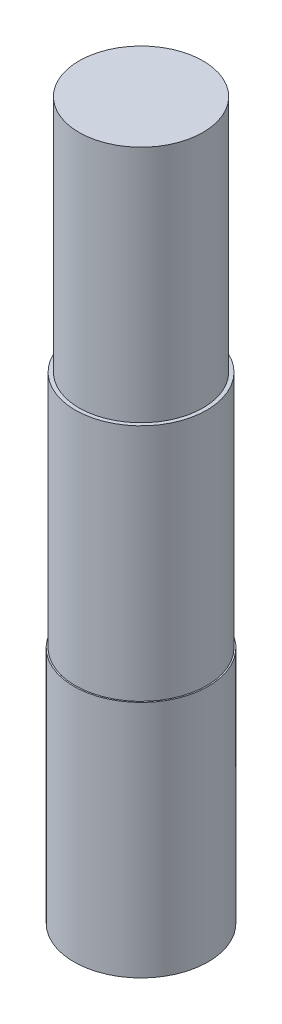
ISO-10303-21;
HEADER;
FILE_DESCRIPTION(('STEP AP214'),'2;1');
FILE_NAME('part.step','',(''),(''),'','','');
FILE_SCHEMA(('AUTOMOTIVE_DESIGN { 1 0 10303 214 1 1 1 1 }'));
ENDSEC;
DATA;
#1=APPLICATION_CONTEXT('core data for automotive mechanical design processes');
#2=APPLICATION_PROTOCOL_DEFINITION('international standard','automotive_design',2000,#1);
#3=PRODUCT_CONTEXT('',#1,'mechanical');
#4=PRODUCT('Part','Part','',(#3));
#5=PRODUCT_RELATED_PRODUCT_CATEGORY('part','',(#4));
#6=PRODUCT_DEFINITION_FORMATION('','',#4);
#7=PRODUCT_DEFINITION_CONTEXT('part definition',#1,'design');
#8=PRODUCT_DEFINITION('design','',#6,#7);
#9=PRODUCT_DEFINITION_SHAPE('','',#8);
#10=(LENGTH_UNIT() NAMED_UNIT(*) SI_UNIT(.MILLI.,.METRE.));
#11=(NAMED_UNIT(*) PLANE_ANGLE_UNIT() SI_UNIT($,.RADIAN.));
#12=(NAMED_UNIT(*) SI_UNIT($,.STERADIAN.) SOLID_ANGLE_UNIT());
#13=UNCERTAINTY_MEASURE_WITH_UNIT(LENGTH_MEASURE(1.E-05),#10,'distance_accuracy_value','');
#14=(GEOMETRIC_REPRESENTATION_CONTEXT(3) GLOBAL_UNCERTAINTY_ASSIGNED_CONTEXT((#13)) GLOBAL_UNIT_ASSIGNED_CONTEXT((#10,
#11,#12)) REPRESENTATION_CONTEXT('',''));
#15=CARTESIAN_POINT('',(0.,0.,0.));
#16=DIRECTION('',(0.,0.,1.));
#17=DIRECTION('',(1.,0.,0.));
#18=AXIS2_PLACEMENT_3D('',#15,#16,#17);
#19=CARTESIAN_POINT('',(0.,12.7,0.));
#20=DIRECTION('',(0.,1.,0.));
#21=DIRECTION('',(0.,0.,1.));
#22=AXIS2_PLACEMENT_3D('',#19,#20,#21);
#23=PLANE('',#22);
#24=CARTESIAN_POINT('',(0.,12.7,0.));
#25=DIRECTION('',(0.,1.,0.));
#26=DIRECTION('',(0.,0.,1.));
#27=AXIS2_PLACEMENT_3D('',#24,#25,#26);
#28=CIRCLE('',#27,3.5);
#29=CARTESIAN_POINT('',(0.,12.7,3.5));
#30=VERTEX_POINT('',#29);
#31=EDGE_CURVE('E43',#30,#30,#28,.T.);
#32=ORIENTED_EDGE('',*,*,#31,.F.);
#33=EDGE_LOOP('',(#32));
#34=FACE_BOUND('',#33,.T.);
#35=CARTESIAN_POINT('',(0.,12.7,0.));
#36=DIRECTION('',(0.,-1.,0.));
#37=DIRECTION('',(0.,0.,-1.));
#38=AXIS2_PLACEMENT_3D('',#35,#36,#37);
#39=CIRCLE('',#38,3.571875);
#40=CARTESIAN_POINT('',(0.,12.7,-3.571875));
#41=VERTEX_POINT('',#40);
#42=EDGE_CURVE('E48',#41,#41,#39,.T.);
#43=ORIENTED_EDGE('',*,*,#42,.F.);
#44=EDGE_LOOP('',(#43));
#45=FACE_BOUND('',#44,.T.);
#46=ADVANCED_FACE('F32',(#34,#45),#23,.T.);
#47=CARTESIAN_POINT('',(0.,25.4,0.));
#48=DIRECTION('',(0.,1.,0.));
#49=DIRECTION('',(0.,0.,1.));
#50=AXIS2_PLACEMENT_3D('',#47,#48,#49);
#51=PLANE('',#50);
#52=CARTESIAN_POINT('',(0.,25.4,0.));
#53=DIRECTION('',(0.,1.,0.));
#54=DIRECTION('',(0.,0.,1.));
#55=AXIS2_PLACEMENT_3D('',#52,#53,#54);
#56=CIRCLE('',#55,3.3);
#57=CARTESIAN_POINT('',(0.,25.4,3.3));
#58=VERTEX_POINT('',#57);
#59=EDGE_CURVE('E10',#58,#58,#56,.T.);
#60=ORIENTED_EDGE('',*,*,#59,.F.);
#61=EDGE_LOOP('',(#60));
#62=FACE_BOUND('',#61,.T.);
#63=CARTESIAN_POINT('',(0.,25.4,0.));
#64=DIRECTION('',(0.,1.,0.));
#65=DIRECTION('',(0.,0.,1.));
#66=AXIS2_PLACEMENT_3D('',#63,#64,#65);
#67=CIRCLE('',#66,3.5);
#68=CARTESIAN_POINT('',(0.,25.4,3.5));
#69=VERTEX_POINT('',#68);
#70=EDGE_CURVE('E45',#69,#69,#67,.T.);
#71=ORIENTED_EDGE('',*,*,#70,.T.);
#72=EDGE_LOOP('',(#71));
#73=FACE_BOUND('',#72,.T.);
#74=ADVANCED_FACE('F61',(#62,#73),#51,.T.);
#75=CARTESIAN_POINT('',(0.,25.4,0.));
#76=DIRECTION('',(0.,1.,0.));
#77=DIRECTION('',(0.,0.,1.));
#78=AXIS2_PLACEMENT_3D('',#75,#76,#77);
#79=CYLINDRICAL_SURFACE('',#78,3.3);
#80=ORIENTED_EDGE('',*,*,#59,.T.);
#81=EDGE_LOOP('',(#80));
#82=FACE_BOUND('',#81,.T.);
#83=CARTESIAN_POINT('',(0.,38.1,0.));
#84=DIRECTION('',(0.,1.,0.));
#85=DIRECTION('',(0.,0.,1.));
#86=AXIS2_PLACEMENT_3D('',#83,#84,#85);
#87=CIRCLE('',#86,3.3);
#88=CARTESIAN_POINT('',(0.,38.1,3.3));
#89=VERTEX_POINT('',#88);
#90=EDGE_CURVE('E36',#89,#89,#87,.T.);
#91=ORIENTED_EDGE('',*,*,#90,.F.);
#92=EDGE_LOOP('',(#91));
#93=FACE_BOUND('',#92,.T.);
#94=ADVANCED_FACE('F67',(#82,#93),#79,.T.);
#95=CARTESIAN_POINT('',(0.,38.1,0.));
#96=DIRECTION('',(0.,1.,0.));
#97=DIRECTION('',(0.,0.,1.));
#98=AXIS2_PLACEMENT_3D('',#95,#96,#97);
#99=PLANE('',#98);
#100=ORIENTED_EDGE('',*,*,#90,.T.);
#101=EDGE_LOOP('',(#100));
#102=FACE_BOUND('',#101,.T.);
#103=ADVANCED_FACE('F76',(#102),#99,.T.);
#104=CARTESIAN_POINT('',(0.,12.7,0.));
#105=DIRECTION('',(0.,1.,0.));
#106=DIRECTION('',(0.,0.,1.));
#107=AXIS2_PLACEMENT_3D('',#104,#105,#106);
#108=CYLINDRICAL_SURFACE('',#107,3.5);
#109=ORIENTED_EDGE('',*,*,#31,.T.);
#110=EDGE_LOOP('',(#109));
#111=FACE_BOUND('',#110,.T.);
#112=ORIENTED_EDGE('',*,*,#70,.F.);
#113=EDGE_LOOP('',(#112));
#114=FACE_BOUND('',#113,.T.);
#115=ADVANCED_FACE('F73',(#111,#114),#108,.T.);
#116=CARTESIAN_POINT('',(0.,12.7,0.));
#117=DIRECTION('',(0.,-1.,0.));
#118=DIRECTION('',(0.,0.,-1.));
#119=AXIS2_PLACEMENT_3D('',#116,#117,#118);
#120=CYLINDRICAL_SURFACE('',#119,3.571875);
#121=ORIENTED_EDGE('',*,*,#42,.T.);
#122=EDGE_LOOP('',(#121));
#123=FACE_BOUND('',#122,.T.);
#124=CARTESIAN_POINT('',(0.,0.,0.));
#125=DIRECTION('',(0.,-1.,0.));
#126=DIRECTION('',(0.,0.,-1.));
#127=AXIS2_PLACEMENT_3D('',#124,#125,#126);
#128=CIRCLE('',#127,3.571875);
#129=CARTESIAN_POINT('',(0.,0.,-3.571875));
#130=VERTEX_POINT('',#129);
#131=EDGE_CURVE('E51',#130,#130,#128,.T.);
#132=ORIENTED_EDGE('',*,*,#131,.F.);
#133=EDGE_LOOP('',(#132));
#134=FACE_BOUND('',#133,.T.);
#135=ADVANCED_FACE('F57',(#123,#134),#120,.T.);
#136=CARTESIAN_POINT('',(0.,0.,0.));
#137=DIRECTION('',(0.,1.,0.));
#138=DIRECTION('',(0.,0.,1.));
#139=AXIS2_PLACEMENT_3D('',#136,#137,#138);
#140=PLANE('',#139);
#141=ORIENTED_EDGE('',*,*,#131,.T.);
#142=EDGE_LOOP('',(#141));
#143=FACE_BOUND('',#142,.T.);
#144=ADVANCED_FACE('F34',(#143),#140,.F.);
#145=CLOSED_SHELL('',(#46,#74,#94,#103,#115,#135,#144));
#146=MANIFOLD_SOLID_BREP('B2',#145);
#147=ADVANCED_BREP_SHAPE_REPRESENTATION('',(#18,#146),#14);
#148=SHAPE_DEFINITION_REPRESENTATION(#9,#147);
ENDSEC;
END-ISO-10303-21;
